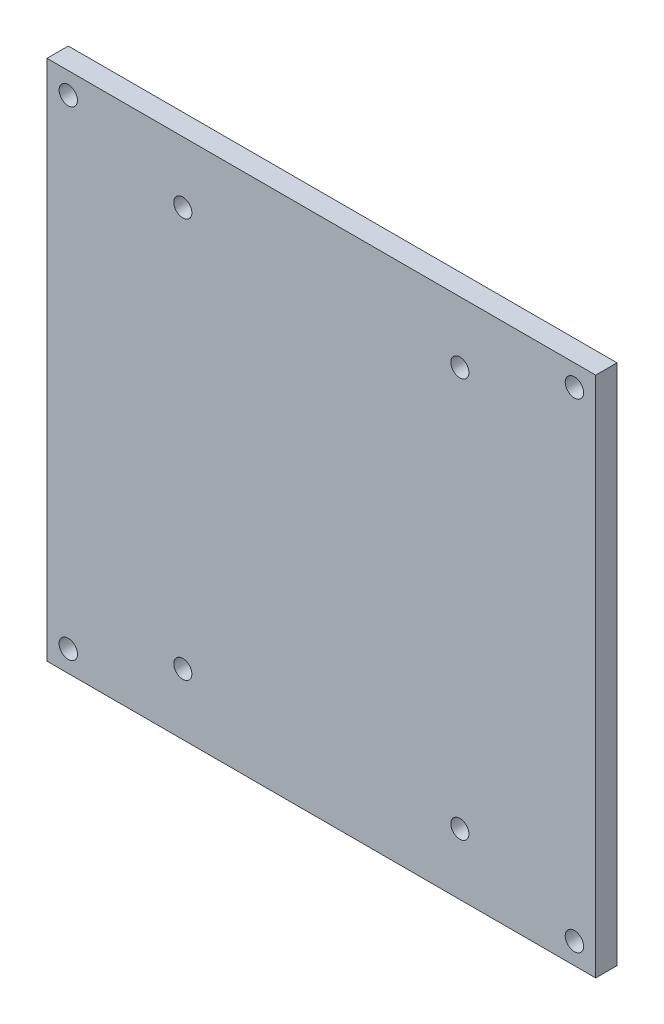
ISO-10303-21;
HEADER;
FILE_DESCRIPTION(('STEP AP214'),'2;1');
FILE_NAME('part.step','',(''),(''),'','','');
FILE_SCHEMA(('AUTOMOTIVE_DESIGN { 1 0 10303 214 1 1 1 1 }'));
ENDSEC;
DATA;
#1=APPLICATION_CONTEXT('core data for automotive mechanical design processes');
#2=APPLICATION_PROTOCOL_DEFINITION('international standard','automotive_design',2000,#1);
#3=PRODUCT_CONTEXT('',#1,'mechanical');
#4=PRODUCT('Part','Part','',(#3));
#5=PRODUCT_RELATED_PRODUCT_CATEGORY('part','',(#4));
#6=PRODUCT_DEFINITION_FORMATION('','',#4);
#7=PRODUCT_DEFINITION_CONTEXT('part definition',#1,'design');
#8=PRODUCT_DEFINITION('design','',#6,#7);
#9=PRODUCT_DEFINITION_SHAPE('','',#8);
#10=(LENGTH_UNIT() NAMED_UNIT(*) SI_UNIT(.MILLI.,.METRE.));
#11=(NAMED_UNIT(*) PLANE_ANGLE_UNIT() SI_UNIT($,.RADIAN.));
#12=(NAMED_UNIT(*) SI_UNIT($,.STERADIAN.) SOLID_ANGLE_UNIT());
#13=UNCERTAINTY_MEASURE_WITH_UNIT(LENGTH_MEASURE(1.E-05),#10,'distance_accuracy_value','');
#14=(GEOMETRIC_REPRESENTATION_CONTEXT(3) GLOBAL_UNCERTAINTY_ASSIGNED_CONTEXT((#13)) GLOBAL_UNIT_ASSIGNED_CONTEXT((#10,
#11,#12)) REPRESENTATION_CONTEXT('',''));
#15=CARTESIAN_POINT('',(0.,0.,0.));
#16=DIRECTION('',(0.,0.,1.));
#17=DIRECTION('',(1.,0.,0.));
#18=AXIS2_PLACEMENT_3D('',#15,#16,#17);
#19=CARTESIAN_POINT('',(51.5,49.,4.));
#20=DIRECTION('',(-1.,0.,0.));
#21=DIRECTION('',(0.,-1.,0.));
#22=AXIS2_PLACEMENT_3D('',#19,#20,#21);
#23=PLANE('',#22);
#24=DIRECTION('',(0.,1.,0.));
#25=VECTOR('',#24,1.);
#26=CARTESIAN_POINT('',(51.5,49.,0.));
#27=LINE('',#26,#25);
#28=CARTESIAN_POINT('',(51.5,-49.,0.));
#29=VERTEX_POINT('',#28);
#30=CARTESIAN_POINT('',(51.5,49.,0.));
#31=VERTEX_POINT('',#30);
#32=EDGE_CURVE('E98',#29,#31,#27,.T.);
#33=ORIENTED_EDGE('',*,*,#32,.T.);
#34=DIRECTION('',(0.,0.,-1.));
#35=VECTOR('',#34,1.);
#36=CARTESIAN_POINT('',(51.5,49.,4.));
#37=LINE('',#36,#35);
#38=CARTESIAN_POINT('',(51.5,49.,4.));
#39=VERTEX_POINT('',#38);
#40=EDGE_CURVE('E11',#39,#31,#37,.T.);
#41=ORIENTED_EDGE('',*,*,#40,.F.);
#42=DIRECTION('',(0.,1.,0.));
#43=VECTOR('',#42,1.);
#44=CARTESIAN_POINT('',(51.5,49.,4.));
#45=LINE('',#44,#43);
#46=CARTESIAN_POINT('',(51.5,-49.,4.));
#47=VERTEX_POINT('',#46);
#48=EDGE_CURVE('E86',#47,#39,#45,.T.);
#49=ORIENTED_EDGE('',*,*,#48,.F.);
#50=DIRECTION('',(0.,0.,-1.));
#51=VECTOR('',#50,1.);
#52=CARTESIAN_POINT('',(51.5,-49.,4.));
#53=LINE('',#52,#51);
#54=EDGE_CURVE('E94',#47,#29,#53,.T.);
#55=ORIENTED_EDGE('',*,*,#54,.T.);
#56=EDGE_LOOP('',(#33,#41,#49,#55));
#57=FACE_BOUND('',#56,.T.);
#58=ADVANCED_FACE('F35',(#57),#23,.F.);
#59=CARTESIAN_POINT('',(-51.5,49.,4.));
#60=DIRECTION('',(0.,-1.,0.));
#61=DIRECTION('',(0.,0.,-1.));
#62=AXIS2_PLACEMENT_3D('',#59,#60,#61);
#63=PLANE('',#62);
#64=DIRECTION('',(-1.,0.,0.));
#65=VECTOR('',#64,1.);
#66=CARTESIAN_POINT('',(-51.5,49.,0.));
#67=LINE('',#66,#65);
#68=CARTESIAN_POINT('',(-51.5,49.,0.));
#69=VERTEX_POINT('',#68);
#70=EDGE_CURVE('E90',#31,#69,#67,.T.);
#71=ORIENTED_EDGE('',*,*,#70,.T.);
#72=DIRECTION('',(0.,0.,-1.));
#73=VECTOR('',#72,1.);
#74=CARTESIAN_POINT('',(-51.5,49.,4.));
#75=LINE('',#74,#73);
#76=CARTESIAN_POINT('',(-51.5,49.,4.));
#77=VERTEX_POINT('',#76);
#78=EDGE_CURVE('E43',#77,#69,#75,.T.);
#79=ORIENTED_EDGE('',*,*,#78,.F.);
#80=DIRECTION('',(-1.,0.,0.));
#81=VECTOR('',#80,1.);
#82=CARTESIAN_POINT('',(-51.5,49.,4.));
#83=LINE('',#82,#81);
#84=EDGE_CURVE('E81',#39,#77,#83,.T.);
#85=ORIENTED_EDGE('',*,*,#84,.F.);
#86=ORIENTED_EDGE('',*,*,#40,.T.);
#87=EDGE_LOOP('',(#71,#79,#85,#86));
#88=FACE_BOUND('',#87,.T.);
#89=ADVANCED_FACE('F89',(#88),#63,.F.);
#90=CARTESIAN_POINT('',(-51.5,49.,4.));
#91=DIRECTION('',(1.,0.,0.));
#92=DIRECTION('',(0.,1.,0.));
#93=AXIS2_PLACEMENT_3D('',#90,#91,#92);
#94=PLANE('',#93);
#95=DIRECTION('',(0.,-1.,0.));
#96=VECTOR('',#95,1.);
#97=CARTESIAN_POINT('',(-51.5,49.,0.));
#98=LINE('',#97,#96);
#99=CARTESIAN_POINT('',(-51.5,-49.,0.));
#100=VERTEX_POINT('',#99);
#101=EDGE_CURVE('E68',#69,#100,#98,.T.);
#102=ORIENTED_EDGE('',*,*,#101,.T.);
#103=DIRECTION('',(0.,0.,-1.));
#104=VECTOR('',#103,1.);
#105=CARTESIAN_POINT('',(-51.5,-49.,4.));
#106=LINE('',#105,#104);
#107=CARTESIAN_POINT('',(-51.5,-49.,4.));
#108=VERTEX_POINT('',#107);
#109=EDGE_CURVE('E91',#108,#100,#106,.T.);
#110=ORIENTED_EDGE('',*,*,#109,.F.);
#111=DIRECTION('',(0.,-1.,0.));
#112=VECTOR('',#111,1.);
#113=CARTESIAN_POINT('',(-51.5,49.,4.));
#114=LINE('',#113,#112);
#115=EDGE_CURVE('E84',#77,#108,#114,.T.);
#116=ORIENTED_EDGE('',*,*,#115,.F.);
#117=ORIENTED_EDGE('',*,*,#78,.T.);
#118=EDGE_LOOP('',(#102,#110,#116,#117));
#119=FACE_BOUND('',#118,.T.);
#120=ADVANCED_FACE('F92',(#119),#94,.F.);
#121=CARTESIAN_POINT('',(-51.5,-49.,4.));
#122=DIRECTION('',(0.,1.,0.));
#123=DIRECTION('',(0.,0.,1.));
#124=AXIS2_PLACEMENT_3D('',#121,#122,#123);
#125=PLANE('',#124);
#126=DIRECTION('',(1.,0.,0.));
#127=VECTOR('',#126,1.);
#128=CARTESIAN_POINT('',(-51.5,-49.,0.));
#129=LINE('',#128,#127);
#130=EDGE_CURVE('E74',#100,#29,#129,.T.);
#131=ORIENTED_EDGE('',*,*,#130,.T.);
#132=ORIENTED_EDGE('',*,*,#54,.F.);
#133=DIRECTION('',(1.,0.,0.));
#134=VECTOR('',#133,1.);
#135=CARTESIAN_POINT('',(-51.5,-49.,4.));
#136=LINE('',#135,#134);
#137=EDGE_CURVE('E51',#108,#47,#136,.T.);
#138=ORIENTED_EDGE('',*,*,#137,.F.);
#139=ORIENTED_EDGE('',*,*,#109,.T.);
#140=EDGE_LOOP('',(#131,#132,#138,#139));
#141=FACE_BOUND('',#140,.T.);
#142=ADVANCED_FACE('F106',(#141),#125,.F.);
#143=CARTESIAN_POINT('',(0.,0.,4.));
#144=DIRECTION('',(0.,0.,1.));
#145=DIRECTION('',(1.,0.,0.));
#146=AXIS2_PLACEMENT_3D('',#143,#144,#145);
#147=PLANE('',#146);
#148=CARTESIAN_POINT('',(-26.,37.5,4.));
#149=DIRECTION('',(0.,0.,1.));
#150=DIRECTION('',(1.,0.,0.));
#151=AXIS2_PLACEMENT_3D('',#148,#149,#150);
#152=CIRCLE('',#151,1.7);
#153=CARTESIAN_POINT('',(-24.3,37.5,4.));
#154=VERTEX_POINT('',#153);
#155=EDGE_CURVE('E142',#154,#154,#152,.T.);
#156=ORIENTED_EDGE('',*,*,#155,.F.);
#157=EDGE_LOOP('',(#156));
#158=FACE_BOUND('',#157,.T.);
#159=CARTESIAN_POINT('',(26.,-37.5,4.));
#160=DIRECTION('',(0.,0.,1.));
#161=DIRECTION('',(1.,0.,0.));
#162=AXIS2_PLACEMENT_3D('',#159,#160,#161);
#163=CIRCLE('',#162,1.7);
#164=CARTESIAN_POINT('',(27.7,-37.5,4.));
#165=VERTEX_POINT('',#164);
#166=EDGE_CURVE('E148',#165,#165,#163,.T.);
#167=ORIENTED_EDGE('',*,*,#166,.F.);
#168=EDGE_LOOP('',(#167));
#169=FACE_BOUND('',#168,.T.);
#170=CARTESIAN_POINT('',(-26.,-37.5,4.));
#171=DIRECTION('',(0.,0.,1.));
#172=DIRECTION('',(1.,0.,0.));
#173=AXIS2_PLACEMENT_3D('',#170,#171,#172);
#174=CIRCLE('',#173,1.7);
#175=CARTESIAN_POINT('',(-24.3,-37.5,4.));
#176=VERTEX_POINT('',#175);
#177=EDGE_CURVE('E154',#176,#176,#174,.T.);
#178=ORIENTED_EDGE('',*,*,#177,.F.);
#179=EDGE_LOOP('',(#178));
#180=FACE_BOUND('',#179,.T.);
#181=CARTESIAN_POINT('',(26.,37.5,4.));
#182=DIRECTION('',(0.,0.,1.));
#183=DIRECTION('',(1.,0.,0.));
#184=AXIS2_PLACEMENT_3D('',#181,#182,#183);
#185=CIRCLE('',#184,1.7);
#186=CARTESIAN_POINT('',(27.7,37.5,4.));
#187=VERTEX_POINT('',#186);
#188=EDGE_CURVE('E136',#187,#187,#185,.T.);
#189=ORIENTED_EDGE('',*,*,#188,.F.);
#190=EDGE_LOOP('',(#189));
#191=FACE_BOUND('',#190,.T.);
#192=CARTESIAN_POINT('',(-47.5,-45.,4.));
#193=DIRECTION('',(0.,0.,1.));
#194=DIRECTION('',(1.,0.,0.));
#195=AXIS2_PLACEMENT_3D('',#192,#193,#194);
#196=CIRCLE('',#195,1.725);
#197=CARTESIAN_POINT('',(-45.775,-45.,4.));
#198=VERTEX_POINT('',#197);
#199=EDGE_CURVE('E118',#198,#198,#196,.T.);
#200=ORIENTED_EDGE('',*,*,#199,.F.);
#201=EDGE_LOOP('',(#200));
#202=FACE_BOUND('',#201,.T.);
#203=CARTESIAN_POINT('',(47.5,-45.,4.));
#204=DIRECTION('',(0.,0.,1.));
#205=DIRECTION('',(1.,0.,0.));
#206=AXIS2_PLACEMENT_3D('',#203,#204,#205);
#207=CIRCLE('',#206,1.725);
#208=CARTESIAN_POINT('',(49.225,-45.,4.));
#209=VERTEX_POINT('',#208);
#210=EDGE_CURVE('E125',#209,#209,#207,.T.);
#211=ORIENTED_EDGE('',*,*,#210,.F.);
#212=EDGE_LOOP('',(#211));
#213=FACE_BOUND('',#212,.T.);
#214=CARTESIAN_POINT('',(47.5,45.,4.));
#215=DIRECTION('',(0.,0.,1.));
#216=DIRECTION('',(1.,0.,0.));
#217=AXIS2_PLACEMENT_3D('',#214,#215,#216);
#218=CIRCLE('',#217,1.725);
#219=CARTESIAN_POINT('',(49.225,45.,4.));
#220=VERTEX_POINT('',#219);
#221=EDGE_CURVE('E131',#220,#220,#218,.T.);
#222=ORIENTED_EDGE('',*,*,#221,.F.);
#223=EDGE_LOOP('',(#222));
#224=FACE_BOUND('',#223,.T.);
#225=CARTESIAN_POINT('',(-47.5,45.,4.));
#226=DIRECTION('',(0.,0.,1.));
#227=DIRECTION('',(1.,0.,0.));
#228=AXIS2_PLACEMENT_3D('',#225,#226,#227);
#229=CIRCLE('',#228,1.725);
#230=CARTESIAN_POINT('',(-45.775,45.,4.));
#231=VERTEX_POINT('',#230);
#232=EDGE_CURVE('E112',#231,#231,#229,.T.);
#233=ORIENTED_EDGE('',*,*,#232,.F.);
#234=EDGE_LOOP('',(#233));
#235=FACE_BOUND('',#234,.T.);
#236=ORIENTED_EDGE('',*,*,#48,.T.);
#237=ORIENTED_EDGE('',*,*,#84,.T.);
#238=ORIENTED_EDGE('',*,*,#115,.T.);
#239=ORIENTED_EDGE('',*,*,#137,.T.);
#240=EDGE_LOOP('',(#236,#237,#238,#239));
#241=FACE_BOUND('',#240,.T.);
#242=ADVANCED_FACE('F82',(#158,#169,#180,#191,#202,#213,#224,#235,#241),#147,.T.);
#243=CARTESIAN_POINT('',(0.,0.,0.));
#244=DIRECTION('',(0.,0.,1.));
#245=DIRECTION('',(1.,0.,0.));
#246=AXIS2_PLACEMENT_3D('',#243,#244,#245);
#247=PLANE('',#246);
#248=CARTESIAN_POINT('',(-26.,37.5,0.));
#249=DIRECTION('',(0.,0.,1.));
#250=DIRECTION('',(1.,0.,0.));
#251=AXIS2_PLACEMENT_3D('',#248,#249,#250);
#252=CIRCLE('',#251,1.7);
#253=CARTESIAN_POINT('',(-24.3,37.5,0.));
#254=VERTEX_POINT('',#253);
#255=EDGE_CURVE('E145',#254,#254,#252,.T.);
#256=ORIENTED_EDGE('',*,*,#255,.T.);
#257=EDGE_LOOP('',(#256));
#258=FACE_BOUND('',#257,.T.);
#259=CARTESIAN_POINT('',(26.,-37.5,0.));
#260=DIRECTION('',(0.,0.,1.));
#261=DIRECTION('',(1.,0.,0.));
#262=AXIS2_PLACEMENT_3D('',#259,#260,#261);
#263=CIRCLE('',#262,1.7);
#264=CARTESIAN_POINT('',(27.7,-37.5,0.));
#265=VERTEX_POINT('',#264);
#266=EDGE_CURVE('E151',#265,#265,#263,.T.);
#267=ORIENTED_EDGE('',*,*,#266,.T.);
#268=EDGE_LOOP('',(#267));
#269=FACE_BOUND('',#268,.T.);
#270=CARTESIAN_POINT('',(-26.,-37.5,0.));
#271=DIRECTION('',(0.,0.,1.));
#272=DIRECTION('',(1.,0.,0.));
#273=AXIS2_PLACEMENT_3D('',#270,#271,#272);
#274=CIRCLE('',#273,1.7);
#275=CARTESIAN_POINT('',(-24.3,-37.5,0.));
#276=VERTEX_POINT('',#275);
#277=EDGE_CURVE('E139',#276,#276,#274,.T.);
#278=ORIENTED_EDGE('',*,*,#277,.T.);
#279=EDGE_LOOP('',(#278));
#280=FACE_BOUND('',#279,.T.);
#281=CARTESIAN_POINT('',(26.,37.5,0.));
#282=DIRECTION('',(0.,0.,1.));
#283=DIRECTION('',(1.,0.,0.));
#284=AXIS2_PLACEMENT_3D('',#281,#282,#283);
#285=CIRCLE('',#284,1.7);
#286=CARTESIAN_POINT('',(27.7,37.5,0.));
#287=VERTEX_POINT('',#286);
#288=EDGE_CURVE('E122',#287,#287,#285,.T.);
#289=ORIENTED_EDGE('',*,*,#288,.T.);
#290=EDGE_LOOP('',(#289));
#291=FACE_BOUND('',#290,.T.);
#292=CARTESIAN_POINT('',(-47.5,-45.,0.));
#293=DIRECTION('',(0.,0.,1.));
#294=DIRECTION('',(1.,0.,0.));
#295=AXIS2_PLACEMENT_3D('',#292,#293,#294);
#296=CIRCLE('',#295,1.725);
#297=CARTESIAN_POINT('',(-45.775,-45.,0.));
#298=VERTEX_POINT('',#297);
#299=EDGE_CURVE('E121',#298,#298,#296,.T.);
#300=ORIENTED_EDGE('',*,*,#299,.T.);
#301=EDGE_LOOP('',(#300));
#302=FACE_BOUND('',#301,.T.);
#303=CARTESIAN_POINT('',(47.5,-45.,0.));
#304=DIRECTION('',(0.,0.,1.));
#305=DIRECTION('',(1.,0.,0.));
#306=AXIS2_PLACEMENT_3D('',#303,#304,#305);
#307=CIRCLE('',#306,1.725);
#308=CARTESIAN_POINT('',(49.225,-45.,0.));
#309=VERTEX_POINT('',#308);
#310=EDGE_CURVE('E128',#309,#309,#307,.T.);
#311=ORIENTED_EDGE('',*,*,#310,.T.);
#312=EDGE_LOOP('',(#311));
#313=FACE_BOUND('',#312,.T.);
#314=CARTESIAN_POINT('',(47.5,45.,0.));
#315=DIRECTION('',(0.,0.,1.));
#316=DIRECTION('',(1.,0.,0.));
#317=AXIS2_PLACEMENT_3D('',#314,#315,#316);
#318=CIRCLE('',#317,1.725);
#319=CARTESIAN_POINT('',(49.225,45.,0.));
#320=VERTEX_POINT('',#319);
#321=EDGE_CURVE('E115',#320,#320,#318,.T.);
#322=ORIENTED_EDGE('',*,*,#321,.T.);
#323=EDGE_LOOP('',(#322));
#324=FACE_BOUND('',#323,.T.);
#325=CARTESIAN_POINT('',(-47.5,45.,0.));
#326=DIRECTION('',(0.,0.,1.));
#327=DIRECTION('',(1.,0.,0.));
#328=AXIS2_PLACEMENT_3D('',#325,#326,#327);
#329=CIRCLE('',#328,1.725);
#330=CARTESIAN_POINT('',(-45.775,45.,0.));
#331=VERTEX_POINT('',#330);
#332=EDGE_CURVE('E101',#331,#331,#329,.T.);
#333=ORIENTED_EDGE('',*,*,#332,.T.);
#334=EDGE_LOOP('',(#333));
#335=FACE_BOUND('',#334,.T.);
#336=ORIENTED_EDGE('',*,*,#32,.F.);
#337=ORIENTED_EDGE('',*,*,#130,.F.);
#338=ORIENTED_EDGE('',*,*,#101,.F.);
#339=ORIENTED_EDGE('',*,*,#70,.F.);
#340=EDGE_LOOP('',(#336,#337,#338,#339));
#341=FACE_BOUND('',#340,.T.);
#342=ADVANCED_FACE('F109',(#258,#269,#280,#291,#302,#313,#324,#335,#341),#247,.F.);
#343=CARTESIAN_POINT('',(-47.5,45.,0.));
#344=DIRECTION('',(0.,0.,1.));
#345=DIRECTION('',(1.,0.,0.));
#346=AXIS2_PLACEMENT_3D('',#343,#344,#345);
#347=CYLINDRICAL_SURFACE('',#346,1.725);
#348=ORIENTED_EDGE('',*,*,#332,.F.);
#349=EDGE_LOOP('',(#348));
#350=FACE_BOUND('',#349,.T.);
#351=ORIENTED_EDGE('',*,*,#232,.T.);
#352=EDGE_LOOP('',(#351));
#353=FACE_BOUND('',#352,.T.);
#354=ADVANCED_FACE('F184',(#350,#353),#347,.F.);
#355=CARTESIAN_POINT('',(47.5,45.,0.));
#356=DIRECTION('',(0.,0.,1.));
#357=DIRECTION('',(1.,0.,0.));
#358=AXIS2_PLACEMENT_3D('',#355,#356,#357);
#359=CYLINDRICAL_SURFACE('',#358,1.725);
#360=ORIENTED_EDGE('',*,*,#321,.F.);
#361=EDGE_LOOP('',(#360));
#362=FACE_BOUND('',#361,.T.);
#363=ORIENTED_EDGE('',*,*,#221,.T.);
#364=EDGE_LOOP('',(#363));
#365=FACE_BOUND('',#364,.T.);
#366=ADVANCED_FACE('F186',(#362,#365),#359,.F.);
#367=CARTESIAN_POINT('',(47.5,-45.,0.));
#368=DIRECTION('',(0.,0.,1.));
#369=DIRECTION('',(1.,0.,0.));
#370=AXIS2_PLACEMENT_3D('',#367,#368,#369);
#371=CYLINDRICAL_SURFACE('',#370,1.725);
#372=ORIENTED_EDGE('',*,*,#310,.F.);
#373=EDGE_LOOP('',(#372));
#374=FACE_BOUND('',#373,.T.);
#375=ORIENTED_EDGE('',*,*,#210,.T.);
#376=EDGE_LOOP('',(#375));
#377=FACE_BOUND('',#376,.T.);
#378=ADVANCED_FACE('F193',(#374,#377),#371,.F.);
#379=CARTESIAN_POINT('',(-47.5,-45.,0.));
#380=DIRECTION('',(0.,0.,1.));
#381=DIRECTION('',(1.,0.,0.));
#382=AXIS2_PLACEMENT_3D('',#379,#380,#381);
#383=CYLINDRICAL_SURFACE('',#382,1.725);
#384=ORIENTED_EDGE('',*,*,#299,.F.);
#385=EDGE_LOOP('',(#384));
#386=FACE_BOUND('',#385,.T.);
#387=ORIENTED_EDGE('',*,*,#199,.T.);
#388=EDGE_LOOP('',(#387));
#389=FACE_BOUND('',#388,.T.);
#390=ADVANCED_FACE('F233',(#386,#389),#383,.F.);
#391=CARTESIAN_POINT('',(26.,37.5,0.));
#392=DIRECTION('',(0.,0.,1.));
#393=DIRECTION('',(1.,0.,0.));
#394=AXIS2_PLACEMENT_3D('',#391,#392,#393);
#395=CYLINDRICAL_SURFACE('',#394,1.7);
#396=ORIENTED_EDGE('',*,*,#288,.F.);
#397=EDGE_LOOP('',(#396));
#398=FACE_BOUND('',#397,.T.);
#399=ORIENTED_EDGE('',*,*,#188,.T.);
#400=EDGE_LOOP('',(#399));
#401=FACE_BOUND('',#400,.T.);
#402=ADVANCED_FACE('F166',(#398,#401),#395,.F.);
#403=CARTESIAN_POINT('',(-26.,-37.5,0.));
#404=DIRECTION('',(0.,0.,1.));
#405=DIRECTION('',(1.,0.,0.));
#406=AXIS2_PLACEMENT_3D('',#403,#404,#405);
#407=CYLINDRICAL_SURFACE('',#406,1.7);
#408=ORIENTED_EDGE('',*,*,#277,.F.);
#409=EDGE_LOOP('',(#408));
#410=FACE_BOUND('',#409,.T.);
#411=ORIENTED_EDGE('',*,*,#177,.T.);
#412=EDGE_LOOP('',(#411));
#413=FACE_BOUND('',#412,.T.);
#414=ADVANCED_FACE('F162',(#410,#413),#407,.F.);
#415=CARTESIAN_POINT('',(26.,-37.5,0.));
#416=DIRECTION('',(0.,0.,1.));
#417=DIRECTION('',(1.,0.,0.));
#418=AXIS2_PLACEMENT_3D('',#415,#416,#417);
#419=CYLINDRICAL_SURFACE('',#418,1.7);
#420=ORIENTED_EDGE('',*,*,#266,.F.);
#421=EDGE_LOOP('',(#420));
#422=FACE_BOUND('',#421,.T.);
#423=ORIENTED_EDGE('',*,*,#166,.T.);
#424=EDGE_LOOP('',(#423));
#425=FACE_BOUND('',#424,.T.);
#426=ADVANCED_FACE('F165',(#422,#425),#419,.F.);
#427=CARTESIAN_POINT('',(-26.,37.5,0.));
#428=DIRECTION('',(0.,0.,1.));
#429=DIRECTION('',(1.,0.,0.));
#430=AXIS2_PLACEMENT_3D('',#427,#428,#429);
#431=CYLINDRICAL_SURFACE('',#430,1.7);
#432=ORIENTED_EDGE('',*,*,#255,.F.);
#433=EDGE_LOOP('',(#432));
#434=FACE_BOUND('',#433,.T.);
#435=ORIENTED_EDGE('',*,*,#155,.T.);
#436=EDGE_LOOP('',(#435));
#437=FACE_BOUND('',#436,.T.);
#438=ADVANCED_FACE('F251',(#434,#437),#431,.F.);
#439=CLOSED_SHELL('',(#58,#89,#120,#142,#242,#342,#354,#366,#378,#390,#402,#414,#426,#438));
#440=MANIFOLD_SOLID_BREP('B2',#439);
#441=ADVANCED_BREP_SHAPE_REPRESENTATION('',(#18,#440),#14);
#442=SHAPE_DEFINITION_REPRESENTATION(#9,#441);
ENDSEC;
END-ISO-10303-21;
